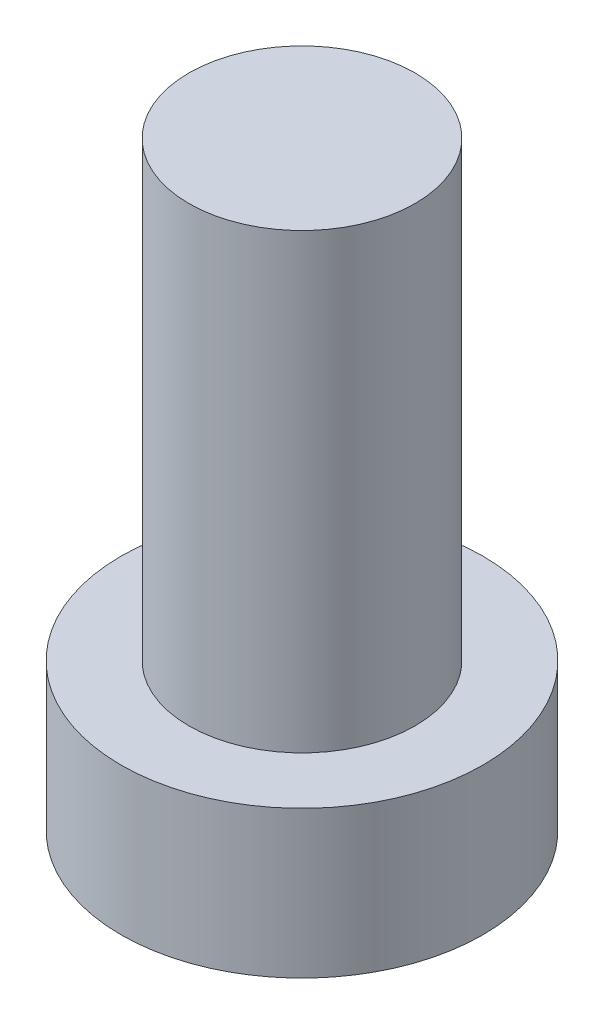
ISO-10303-21;
HEADER;
FILE_DESCRIPTION(('STEP AP214'),'2;1');
FILE_NAME('part.step','',(''),(''),'','','');
FILE_SCHEMA(('AUTOMOTIVE_DESIGN { 1 0 10303 214 1 1 1 1 }'));
ENDSEC;
DATA;
#1=APPLICATION_CONTEXT('core data for automotive mechanical design processes');
#2=APPLICATION_PROTOCOL_DEFINITION('international standard','automotive_design',2000,#1);
#3=PRODUCT_CONTEXT('',#1,'mechanical');
#4=PRODUCT('Part','Part','',(#3));
#5=PRODUCT_RELATED_PRODUCT_CATEGORY('part','',(#4));
#6=PRODUCT_DEFINITION_FORMATION('','',#4);
#7=PRODUCT_DEFINITION_CONTEXT('part definition',#1,'design');
#8=PRODUCT_DEFINITION('design','',#6,#7);
#9=PRODUCT_DEFINITION_SHAPE('','',#8);
#10=(LENGTH_UNIT() NAMED_UNIT(*) SI_UNIT(.MILLI.,.METRE.));
#11=(NAMED_UNIT(*) PLANE_ANGLE_UNIT() SI_UNIT($,.RADIAN.));
#12=(NAMED_UNIT(*) SI_UNIT($,.STERADIAN.) SOLID_ANGLE_UNIT());
#13=UNCERTAINTY_MEASURE_WITH_UNIT(LENGTH_MEASURE(1.E-05),#10,'distance_accuracy_value','');
#14=(GEOMETRIC_REPRESENTATION_CONTEXT(3) GLOBAL_UNCERTAINTY_ASSIGNED_CONTEXT((#13)) GLOBAL_UNIT_ASSIGNED_CONTEXT((#10,
#11,#12)) REPRESENTATION_CONTEXT('',''));
#15=CARTESIAN_POINT('',(0.,0.,0.));
#16=DIRECTION('',(0.,0.,1.));
#17=DIRECTION('',(1.,0.,0.));
#18=AXIS2_PLACEMENT_3D('',#15,#16,#17);
#19=CARTESIAN_POINT('',(0.,1.3,0.));
#20=DIRECTION('',(0.,-1.,0.));
#21=DIRECTION('',(0.,0.,-1.));
#22=AXIS2_PLACEMENT_3D('',#19,#20,#21);
#23=CYLINDRICAL_SURFACE('',#22,1.6);
#24=CARTESIAN_POINT('',(0.,1.3,0.));
#25=DIRECTION('',(0.,1.,0.));
#26=DIRECTION('',(0.,0.,1.));
#27=AXIS2_PLACEMENT_3D('',#24,#25,#26);
#28=CIRCLE('',#27,1.6);
#29=CARTESIAN_POINT('',(0.,1.3,1.6));
#30=VERTEX_POINT('',#29);
#31=EDGE_CURVE('E46',#30,#30,#28,.T.);
#32=ORIENTED_EDGE('',*,*,#31,.F.);
#33=EDGE_LOOP('',(#32));
#34=FACE_BOUND('',#33,.T.);
#35=CARTESIAN_POINT('',(0.,0.,0.));
#36=DIRECTION('',(0.,1.,0.));
#37=DIRECTION('',(0.,0.,1.));
#38=AXIS2_PLACEMENT_3D('',#35,#36,#37);
#39=CIRCLE('',#38,1.6);
#40=CARTESIAN_POINT('',(0.,0.,1.6));
#41=VERTEX_POINT('',#40);
#42=EDGE_CURVE('E42',#41,#41,#39,.T.);
#43=ORIENTED_EDGE('',*,*,#42,.T.);
#44=EDGE_LOOP('',(#43));
#45=FACE_BOUND('',#44,.T.);
#46=ADVANCED_FACE('F39',(#34,#45),#23,.T.);
#47=CARTESIAN_POINT('',(0.,1.3,0.));
#48=DIRECTION('',(0.,1.,0.));
#49=DIRECTION('',(0.,0.,1.));
#50=AXIS2_PLACEMENT_3D('',#47,#48,#49);
#51=PLANE('',#50);
#52=CARTESIAN_POINT('',(0.,1.3,0.));
#53=DIRECTION('',(0.,1.,0.));
#54=DIRECTION('',(0.,0.,1.));
#55=AXIS2_PLACEMENT_3D('',#52,#53,#54);
#56=CIRCLE('',#55,1.);
#57=CARTESIAN_POINT('',(0.,1.3,1.));
#58=VERTEX_POINT('',#57);
#59=EDGE_CURVE('E10',#58,#58,#56,.T.);
#60=ORIENTED_EDGE('',*,*,#59,.F.);
#61=EDGE_LOOP('',(#60));
#62=FACE_BOUND('',#61,.T.);
#63=ORIENTED_EDGE('',*,*,#31,.T.);
#64=EDGE_LOOP('',(#63));
#65=FACE_BOUND('',#64,.T.);
#66=ADVANCED_FACE('F63',(#62,#65),#51,.T.);
#67=CARTESIAN_POINT('',(0.,0.,0.));
#68=DIRECTION('',(0.,1.,0.));
#69=DIRECTION('',(0.,0.,1.));
#70=AXIS2_PLACEMENT_3D('',#67,#68,#69);
#71=PLANE('',#70);
#72=ORIENTED_EDGE('',*,*,#42,.F.);
#73=EDGE_LOOP('',(#72));
#74=FACE_BOUND('',#73,.T.);
#75=ADVANCED_FACE('F60',(#74),#71,.F.);
#76=CARTESIAN_POINT('',(0.,5.3,0.));
#77=DIRECTION('',(0.,-1.,0.));
#78=DIRECTION('',(0.,0.,-1.));
#79=AXIS2_PLACEMENT_3D('',#76,#77,#78);
#80=CYLINDRICAL_SURFACE('',#79,1.);
#81=CARTESIAN_POINT('',(0.,5.3,0.));
#82=DIRECTION('',(0.,1.,0.));
#83=DIRECTION('',(0.,0.,1.));
#84=AXIS2_PLACEMENT_3D('',#81,#82,#83);
#85=CIRCLE('',#84,1.);
#86=CARTESIAN_POINT('',(0.,5.3,1.));
#87=VERTEX_POINT('',#86);
#88=EDGE_CURVE('E52',#87,#87,#85,.T.);
#89=ORIENTED_EDGE('',*,*,#88,.F.);
#90=EDGE_LOOP('',(#89));
#91=FACE_BOUND('',#90,.T.);
#92=ORIENTED_EDGE('',*,*,#59,.T.);
#93=EDGE_LOOP('',(#92));
#94=FACE_BOUND('',#93,.T.);
#95=ADVANCED_FACE('F62',(#91,#94),#80,.T.);
#96=CARTESIAN_POINT('',(0.,5.3,0.));
#97=DIRECTION('',(0.,1.,0.));
#98=DIRECTION('',(0.,0.,1.));
#99=AXIS2_PLACEMENT_3D('',#96,#97,#98);
#100=PLANE('',#99);
#101=ORIENTED_EDGE('',*,*,#88,.T.);
#102=EDGE_LOOP('',(#101));
#103=FACE_BOUND('',#102,.T.);
#104=ADVANCED_FACE('F68',(#103),#100,.T.);
#105=CLOSED_SHELL('',(#46,#66,#75,#95,#104));
#106=MANIFOLD_SOLID_BREP('B2',#105);
#107=ADVANCED_BREP_SHAPE_REPRESENTATION('',(#18,#106),#14);
#108=SHAPE_DEFINITION_REPRESENTATION(#9,#107);
ENDSEC;
END-ISO-10303-21;
